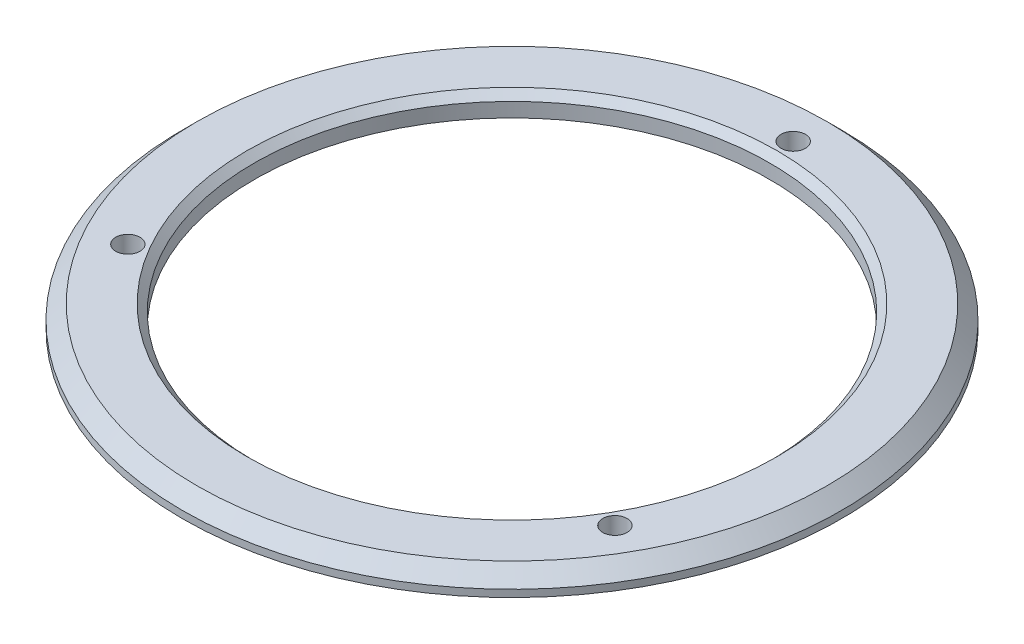
ISO-10303-21;
HEADER;
FILE_DESCRIPTION(('STEP AP214'),'2;1');
FILE_NAME('part.step','',(''),(''),'','','');
FILE_SCHEMA(('AUTOMOTIVE_DESIGN { 1 0 10303 214 1 1 1 1 }'));
ENDSEC;
DATA;
#1=APPLICATION_CONTEXT('core data for automotive mechanical design processes');
#2=APPLICATION_PROTOCOL_DEFINITION('international standard','automotive_design',2000,#1);
#3=PRODUCT_CONTEXT('',#1,'mechanical');
#4=PRODUCT('Part','Part','',(#3));
#5=PRODUCT_RELATED_PRODUCT_CATEGORY('part','',(#4));
#6=PRODUCT_DEFINITION_FORMATION('','',#4);
#7=PRODUCT_DEFINITION_CONTEXT('part definition',#1,'design');
#8=PRODUCT_DEFINITION('design','',#6,#7);
#9=PRODUCT_DEFINITION_SHAPE('','',#8);
#10=(LENGTH_UNIT() NAMED_UNIT(*) SI_UNIT(.MILLI.,.METRE.));
#11=(NAMED_UNIT(*) PLANE_ANGLE_UNIT() SI_UNIT($,.RADIAN.));
#12=(NAMED_UNIT(*) SI_UNIT($,.STERADIAN.) SOLID_ANGLE_UNIT());
#13=UNCERTAINTY_MEASURE_WITH_UNIT(LENGTH_MEASURE(1.E-05),#10,'distance_accuracy_value','');
#14=(GEOMETRIC_REPRESENTATION_CONTEXT(3) GLOBAL_UNCERTAINTY_ASSIGNED_CONTEXT((#13)) GLOBAL_UNIT_ASSIGNED_CONTEXT((#10,
#11,#12)) REPRESENTATION_CONTEXT('',''));
#15=CARTESIAN_POINT('',(0.,0.,0.));
#16=DIRECTION('',(0.,0.,1.));
#17=DIRECTION('',(1.,0.,0.));
#18=AXIS2_PLACEMENT_3D('',#15,#16,#17);
#19=CARTESIAN_POINT('',(0.,3.,0.));
#20=DIRECTION('',(0.,1.,0.));
#21=DIRECTION('',(0.,0.,1.));
#22=AXIS2_PLACEMENT_3D('',#19,#20,#21);
#23=PLANE('',#22);
#24=CARTESIAN_POINT('',(0.,3.,0.));
#25=DIRECTION('',(0.,1.,0.));
#26=DIRECTION('',(0.,0.,1.));
#27=AXIS2_PLACEMENT_3D('',#24,#25,#26);
#28=CIRCLE('',#27,37.);
#29=CARTESIAN_POINT('',(0.,3.,37.));
#30=VERTEX_POINT('',#29);
#31=EDGE_CURVE('E10',#30,#30,#28,.F.);
#32=ORIENTED_EDGE('',*,*,#31,.T.);
#33=EDGE_LOOP('',(#32));
#34=FACE_BOUND('',#33,.T.);
#35=CARTESIAN_POINT('',(-33.9923631239429,3.,19.6255000000002));
#36=DIRECTION('',(0.,1.,0.));
#37=DIRECTION('',(0.866025403784436,0.,-0.500000000000004));
#38=AXIS2_PLACEMENT_3D('',#35,#36,#37);
#39=CIRCLE('',#38,1.7);
#40=CARTESIAN_POINT('',(-32.5201199375094,3.,18.7755000000002));
#41=VERTEX_POINT('',#40);
#42=EDGE_CURVE('E74',#41,#41,#39,.T.);
#43=ORIENTED_EDGE('',*,*,#42,.F.);
#44=EDGE_LOOP('',(#43));
#45=FACE_BOUND('',#44,.T.);
#46=CARTESIAN_POINT('',(33.9923631239432,3.,19.6254999999997));
#47=DIRECTION('',(0.,1.,0.));
#48=DIRECTION('',(-0.866025403784443,0.,-0.499999999999992));
#49=AXIS2_PLACEMENT_3D('',#46,#47,#48);
#50=CIRCLE('',#49,1.7);
#51=CARTESIAN_POINT('',(32.5201199375096,3.,18.7754999999997));
#52=VERTEX_POINT('',#51);
#53=EDGE_CURVE('E68',#52,#52,#50,.T.);
#54=ORIENTED_EDGE('',*,*,#53,.F.);
#55=EDGE_LOOP('',(#54));
#56=FACE_BOUND('',#55,.T.);
#57=CARTESIAN_POINT('',(0.,3.,-39.251));
#58=DIRECTION('',(0.,1.,0.));
#59=DIRECTION('',(0.,0.,1.));
#60=AXIS2_PLACEMENT_3D('',#57,#58,#59);
#61=CIRCLE('',#60,1.7);
#62=CARTESIAN_POINT('',(0.,3.,-37.551));
#63=VERTEX_POINT('',#62);
#64=EDGE_CURVE('E62',#63,#63,#61,.T.);
#65=ORIENTED_EDGE('',*,*,#64,.F.);
#66=EDGE_LOOP('',(#65));
#67=FACE_BOUND('',#66,.T.);
#68=CARTESIAN_POINT('',(0.,3.,0.));
#69=DIRECTION('',(0.,1.,0.));
#70=DIRECTION('',(0.,0.,1.));
#71=AXIS2_PLACEMENT_3D('',#68,#69,#70);
#72=CIRCLE('',#71,44.);
#73=CARTESIAN_POINT('',(0.,3.,44.));
#74=VERTEX_POINT('',#73);
#75=EDGE_CURVE('E50',#74,#74,#72,.T.);
#76=ORIENTED_EDGE('',*,*,#75,.T.);
#77=EDGE_LOOP('',(#76));
#78=FACE_BOUND('',#77,.T.);
#79=ADVANCED_FACE('F35',(#34,#45,#56,#67,#78),#23,.T.);
#80=CARTESIAN_POINT('',(0.,0.,0.));
#81=DIRECTION('',(0.,1.,0.));
#82=DIRECTION('',(0.,0.,1.));
#83=AXIS2_PLACEMENT_3D('',#80,#81,#82);
#84=PLANE('',#83);
#85=CARTESIAN_POINT('',(-33.9923631239429,0.,19.6255000000002));
#86=DIRECTION('',(0.,1.,0.));
#87=DIRECTION('',(0.866025403784436,0.,-0.500000000000004));
#88=AXIS2_PLACEMENT_3D('',#85,#86,#87);
#89=CIRCLE('',#88,1.7);
#90=CARTESIAN_POINT('',(-32.5201199375094,0.,18.7755000000002));
#91=VERTEX_POINT('',#90);
#92=EDGE_CURVE('E65',#91,#91,#89,.T.);
#93=ORIENTED_EDGE('',*,*,#92,.T.);
#94=EDGE_LOOP('',(#93));
#95=FACE_BOUND('',#94,.T.);
#96=CARTESIAN_POINT('',(33.9923631239432,0.,19.6254999999997));
#97=DIRECTION('',(0.,1.,0.));
#98=DIRECTION('',(-0.866025403784443,0.,-0.499999999999992));
#99=AXIS2_PLACEMENT_3D('',#96,#97,#98);
#100=CIRCLE('',#99,1.7);
#101=CARTESIAN_POINT('',(32.5201199375096,0.,18.7754999999997));
#102=VERTEX_POINT('',#101);
#103=EDGE_CURVE('E71',#102,#102,#100,.T.);
#104=ORIENTED_EDGE('',*,*,#103,.T.);
#105=EDGE_LOOP('',(#104));
#106=FACE_BOUND('',#105,.T.);
#107=CARTESIAN_POINT('',(0.,0.,-39.251));
#108=DIRECTION('',(0.,1.,0.));
#109=DIRECTION('',(0.,0.,1.));
#110=AXIS2_PLACEMENT_3D('',#107,#108,#109);
#111=CIRCLE('',#110,1.7);
#112=CARTESIAN_POINT('',(0.,0.,-37.551));
#113=VERTEX_POINT('',#112);
#114=EDGE_CURVE('E61',#113,#113,#111,.T.);
#115=ORIENTED_EDGE('',*,*,#114,.T.);
#116=EDGE_LOOP('',(#115));
#117=FACE_BOUND('',#116,.T.);
#118=CARTESIAN_POINT('',(0.,0.,0.));
#119=DIRECTION('',(0.,1.,0.));
#120=DIRECTION('',(0.,0.,1.));
#121=AXIS2_PLACEMENT_3D('',#118,#119,#120);
#122=CIRCLE('',#121,46.);
#123=CARTESIAN_POINT('',(0.,0.,46.));
#124=VERTEX_POINT('',#123);
#125=EDGE_CURVE('E55',#124,#124,#122,.T.);
#126=ORIENTED_EDGE('',*,*,#125,.F.);
#127=EDGE_LOOP('',(#126));
#128=FACE_BOUND('',#127,.T.);
#129=CARTESIAN_POINT('',(0.,0.,0.));
#130=DIRECTION('',(0.,1.,0.));
#131=DIRECTION('',(0.,0.,1.));
#132=AXIS2_PLACEMENT_3D('',#129,#130,#131);
#133=CIRCLE('',#132,36.);
#134=CARTESIAN_POINT('',(0.,0.,36.));
#135=VERTEX_POINT('',#134);
#136=EDGE_CURVE('E58',#135,#135,#133,.T.);
#137=ORIENTED_EDGE('',*,*,#136,.T.);
#138=EDGE_LOOP('',(#137));
#139=FACE_BOUND('',#138,.T.);
#140=ADVANCED_FACE('F80',(#95,#106,#117,#128,#139),#84,.F.);
#141=CARTESIAN_POINT('',(0.,3.,0.));
#142=DIRECTION('',(0.,-1.,0.));
#143=DIRECTION('',(0.,0.,-1.));
#144=AXIS2_PLACEMENT_3D('',#141,#142,#143);
#145=CYLINDRICAL_SURFACE('',#144,46.);
#146=CARTESIAN_POINT('',(0.,0.999999999999984,0.));
#147=DIRECTION('',(0.,1.,0.));
#148=DIRECTION('',(0.,0.,1.));
#149=AXIS2_PLACEMENT_3D('',#146,#147,#148);
#150=CIRCLE('',#149,46.);
#151=CARTESIAN_POINT('',(0.,0.999999999999984,46.));
#152=VERTEX_POINT('',#151);
#153=EDGE_CURVE('E46',#152,#152,#150,.F.);
#154=ORIENTED_EDGE('',*,*,#153,.T.);
#155=EDGE_LOOP('',(#154));
#156=FACE_BOUND('',#155,.T.);
#157=ORIENTED_EDGE('',*,*,#125,.T.);
#158=EDGE_LOOP('',(#157));
#159=FACE_BOUND('',#158,.T.);
#160=ADVANCED_FACE('F110',(#156,#159),#145,.T.);
#161=CARTESIAN_POINT('',(0.,3.,0.));
#162=DIRECTION('',(0.,-1.,0.));
#163=DIRECTION('',(0.,0.,-1.));
#164=AXIS2_PLACEMENT_3D('',#161,#162,#163);
#165=CYLINDRICAL_SURFACE('',#164,36.);
#166=CARTESIAN_POINT('',(0.,1.99999999999998,0.));
#167=DIRECTION('',(0.,1.,0.));
#168=DIRECTION('',(0.,0.,1.));
#169=AXIS2_PLACEMENT_3D('',#166,#167,#168);
#170=CIRCLE('',#169,36.);
#171=CARTESIAN_POINT('',(0.,1.99999999999998,36.));
#172=VERTEX_POINT('',#171);
#173=EDGE_CURVE('E42',#172,#172,#170,.T.);
#174=ORIENTED_EDGE('',*,*,#173,.T.);
#175=EDGE_LOOP('',(#174));
#176=FACE_BOUND('',#175,.T.);
#177=ORIENTED_EDGE('',*,*,#136,.F.);
#178=EDGE_LOOP('',(#177));
#179=FACE_BOUND('',#178,.T.);
#180=ADVANCED_FACE('F102',(#176,#179),#165,.F.);
#181=CARTESIAN_POINT('',(0.,3.,0.));
#182=DIRECTION('',(0.,-1.,0.));
#183=DIRECTION('',(0.,0.,-1.));
#184=AXIS2_PLACEMENT_3D('',#181,#182,#183);
#185=CONICAL_SURFACE('',#184,44.,0.785398163397447);
#186=ORIENTED_EDGE('',*,*,#153,.F.);
#187=EDGE_LOOP('',(#186));
#188=FACE_BOUND('',#187,.T.);
#189=ORIENTED_EDGE('',*,*,#75,.F.);
#190=EDGE_LOOP('',(#189));
#191=FACE_BOUND('',#190,.T.);
#192=ADVANCED_FACE('F99',(#188,#191),#185,.T.);
#193=CARTESIAN_POINT('',(0.,0.,-39.251));
#194=DIRECTION('',(0.,1.,0.));
#195=DIRECTION('',(0.,0.,1.));
#196=AXIS2_PLACEMENT_3D('',#193,#194,#195);
#197=CYLINDRICAL_SURFACE('',#196,1.7);
#198=ORIENTED_EDGE('',*,*,#114,.F.);
#199=EDGE_LOOP('',(#198));
#200=FACE_BOUND('',#199,.T.);
#201=ORIENTED_EDGE('',*,*,#64,.T.);
#202=EDGE_LOOP('',(#201));
#203=FACE_BOUND('',#202,.T.);
#204=ADVANCED_FACE('F101',(#200,#203),#197,.F.);
#205=CARTESIAN_POINT('',(33.9923631239432,0.,19.6254999999997));
#206=DIRECTION('',(0.,1.,0.));
#207=DIRECTION('',(0.,0.,1.));
#208=AXIS2_PLACEMENT_3D('',#205,#206,#207);
#209=CYLINDRICAL_SURFACE('',#208,1.7);
#210=ORIENTED_EDGE('',*,*,#103,.F.);
#211=EDGE_LOOP('',(#210));
#212=FACE_BOUND('',#211,.T.);
#213=ORIENTED_EDGE('',*,*,#53,.T.);
#214=EDGE_LOOP('',(#213));
#215=FACE_BOUND('',#214,.T.);
#216=ADVANCED_FACE('F86',(#212,#215),#209,.F.);
#217=CARTESIAN_POINT('',(-33.9923631239429,0.,19.6255000000002));
#218=DIRECTION('',(0.,1.,0.));
#219=DIRECTION('',(0.,0.,1.));
#220=AXIS2_PLACEMENT_3D('',#217,#218,#219);
#221=CYLINDRICAL_SURFACE('',#220,1.7);
#222=ORIENTED_EDGE('',*,*,#92,.F.);
#223=EDGE_LOOP('',(#222));
#224=FACE_BOUND('',#223,.T.);
#225=ORIENTED_EDGE('',*,*,#42,.T.);
#226=EDGE_LOOP('',(#225));
#227=FACE_BOUND('',#226,.T.);
#228=ADVANCED_FACE('F83',(#224,#227),#221,.F.);
#229=CARTESIAN_POINT('',(0.,1.99999999999998,0.));
#230=DIRECTION('',(0.,1.,0.));
#231=DIRECTION('',(0.,0.,1.));
#232=AXIS2_PLACEMENT_3D('',#229,#230,#231);
#233=CONICAL_SURFACE('',#232,36.,0.785398163397448);
#234=ORIENTED_EDGE('',*,*,#31,.F.);
#235=EDGE_LOOP('',(#234));
#236=FACE_BOUND('',#235,.T.);
#237=ORIENTED_EDGE('',*,*,#173,.F.);
#238=EDGE_LOOP('',(#237));
#239=FACE_BOUND('',#238,.T.);
#240=ADVANCED_FACE('F37',(#236,#239),#233,.F.);
#241=CLOSED_SHELL('',(#79,#140,#160,#180,#192,#204,#216,#228,#240));
#242=MANIFOLD_SOLID_BREP('B2',#241);
#243=ADVANCED_BREP_SHAPE_REPRESENTATION('',(#18,#242),#14);
#244=SHAPE_DEFINITION_REPRESENTATION(#9,#243);
ENDSEC;
END-ISO-10303-21;
